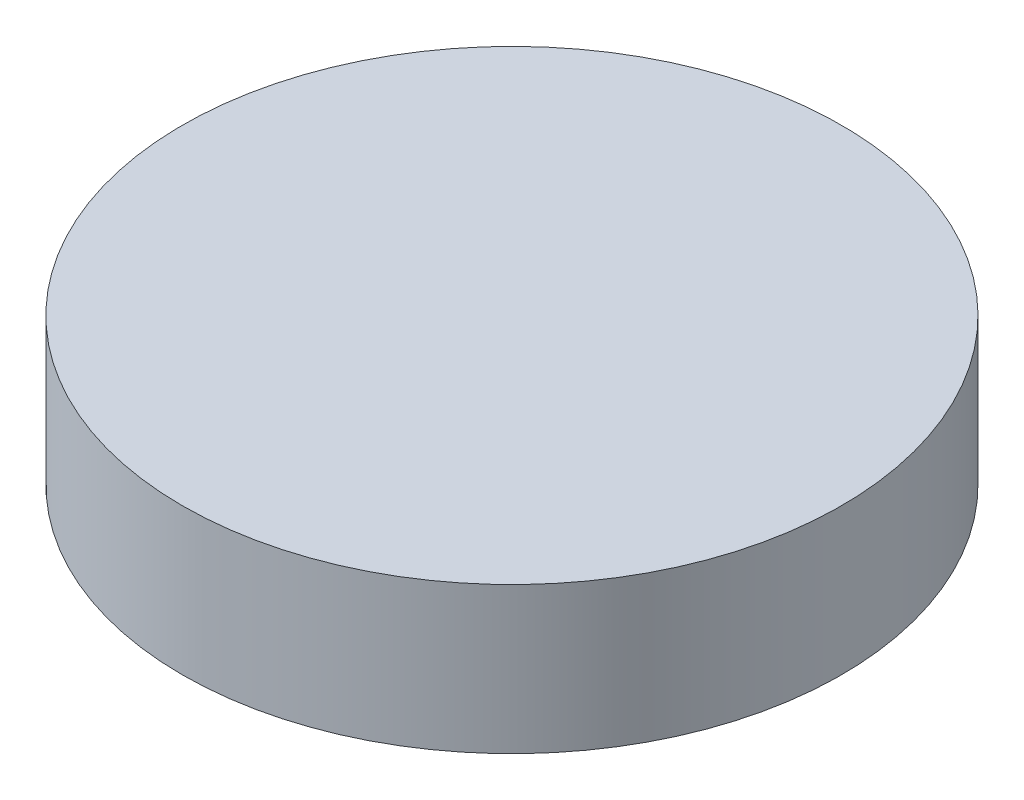
ISO-10303-21;
HEADER;
FILE_DESCRIPTION(('STEP AP214'),'2;1');
FILE_NAME('part.step','',(''),(''),'','','');
FILE_SCHEMA(('AUTOMOTIVE_DESIGN { 1 0 10303 214 1 1 1 1 }'));
ENDSEC;
DATA;
#1=APPLICATION_CONTEXT('core data for automotive mechanical design processes');
#2=APPLICATION_PROTOCOL_DEFINITION('international standard','automotive_design',2000,#1);
#3=PRODUCT_CONTEXT('',#1,'mechanical');
#4=PRODUCT('Part','Part','',(#3));
#5=PRODUCT_RELATED_PRODUCT_CATEGORY('part','',(#4));
#6=PRODUCT_DEFINITION_FORMATION('','',#4);
#7=PRODUCT_DEFINITION_CONTEXT('part definition',#1,'design');
#8=PRODUCT_DEFINITION('design','',#6,#7);
#9=PRODUCT_DEFINITION_SHAPE('','',#8);
#10=(LENGTH_UNIT() NAMED_UNIT(*) SI_UNIT(.MILLI.,.METRE.));
#11=(NAMED_UNIT(*) PLANE_ANGLE_UNIT() SI_UNIT($,.RADIAN.));
#12=(NAMED_UNIT(*) SI_UNIT($,.STERADIAN.) SOLID_ANGLE_UNIT());
#13=UNCERTAINTY_MEASURE_WITH_UNIT(LENGTH_MEASURE(1.E-05),#10,'distance_accuracy_value','');
#14=(GEOMETRIC_REPRESENTATION_CONTEXT(3) GLOBAL_UNCERTAINTY_ASSIGNED_CONTEXT((#13)) GLOBAL_UNIT_ASSIGNED_CONTEXT((#10,
#11,#12)) REPRESENTATION_CONTEXT('',''));
#15=CARTESIAN_POINT('',(0.,0.,0.));
#16=DIRECTION('',(0.,0.,1.));
#17=DIRECTION('',(1.,0.,0.));
#18=AXIS2_PLACEMENT_3D('',#15,#16,#17);
#19=CARTESIAN_POINT('',(0.,0.4,0.));
#20=DIRECTION('',(0.,-1.,0.));
#21=DIRECTION('',(0.,0.,-1.));
#22=AXIS2_PLACEMENT_3D('',#19,#20,#21);
#23=CYLINDRICAL_SURFACE('',#22,0.9);
#24=CARTESIAN_POINT('',(0.,0.4,0.));
#25=DIRECTION('',(0.,1.,0.));
#26=DIRECTION('',(0.,0.,1.));
#27=AXIS2_PLACEMENT_3D('',#24,#25,#26);
#28=CIRCLE('',#27,0.9);
#29=CARTESIAN_POINT('',(0.,0.4,0.9));
#30=VERTEX_POINT('',#29);
#31=EDGE_CURVE('E10',#30,#30,#28,.T.);
#32=ORIENTED_EDGE('',*,*,#31,.F.);
#33=EDGE_LOOP('',(#32));
#34=FACE_BOUND('',#33,.T.);
#35=CARTESIAN_POINT('',(0.,0.,0.));
#36=DIRECTION('',(0.,1.,0.));
#37=DIRECTION('',(0.,0.,1.));
#38=AXIS2_PLACEMENT_3D('',#35,#36,#37);
#39=CIRCLE('',#38,0.9);
#40=CARTESIAN_POINT('',(0.,0.,0.9));
#41=VERTEX_POINT('',#40);
#42=EDGE_CURVE('E35',#41,#41,#39,.T.);
#43=ORIENTED_EDGE('',*,*,#42,.T.);
#44=EDGE_LOOP('',(#43));
#45=FACE_BOUND('',#44,.T.);
#46=ADVANCED_FACE('F32',(#34,#45),#23,.T.);
#47=CARTESIAN_POINT('',(0.,0.4,0.));
#48=DIRECTION('',(0.,1.,0.));
#49=DIRECTION('',(0.,0.,1.));
#50=AXIS2_PLACEMENT_3D('',#47,#48,#49);
#51=PLANE('',#50);
#52=ORIENTED_EDGE('',*,*,#31,.T.);
#53=EDGE_LOOP('',(#52));
#54=FACE_BOUND('',#53,.T.);
#55=ADVANCED_FACE('F47',(#54),#51,.T.);
#56=CARTESIAN_POINT('',(0.,0.,0.));
#57=DIRECTION('',(0.,1.,0.));
#58=DIRECTION('',(0.,0.,1.));
#59=AXIS2_PLACEMENT_3D('',#56,#57,#58);
#60=PLANE('',#59);
#61=ORIENTED_EDGE('',*,*,#42,.F.);
#62=EDGE_LOOP('',(#61));
#63=FACE_BOUND('',#62,.T.);
#64=ADVANCED_FACE('F45',(#63),#60,.F.);
#65=CLOSED_SHELL('',(#46,#55,#64));
#66=MANIFOLD_SOLID_BREP('B2',#65);
#67=ADVANCED_BREP_SHAPE_REPRESENTATION('',(#18,#66),#14);
#68=SHAPE_DEFINITION_REPRESENTATION(#9,#67);
ENDSEC;
END-ISO-10303-21;
